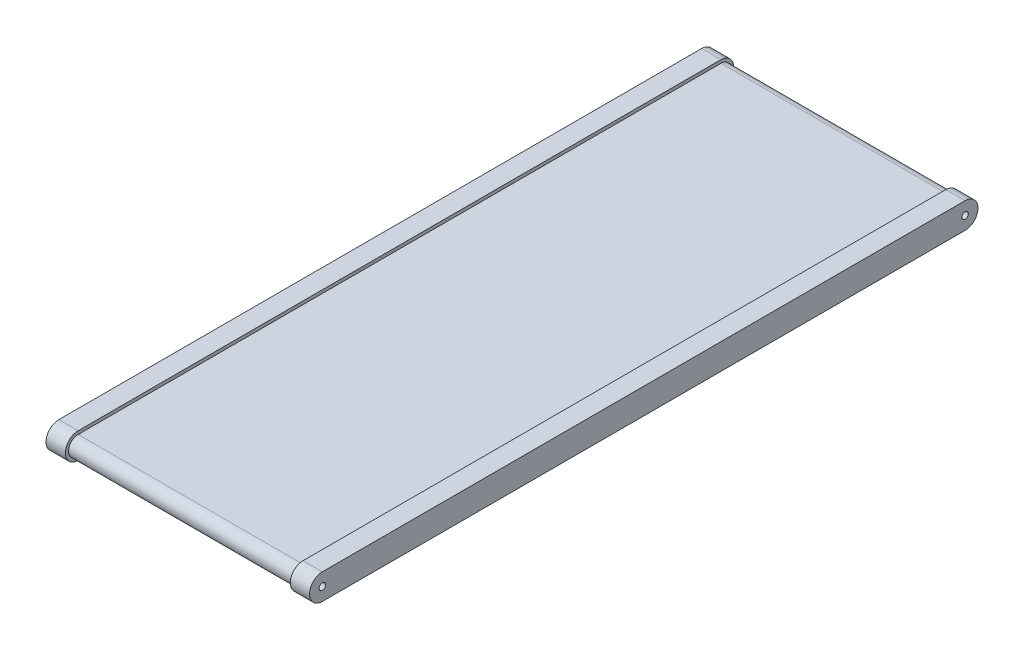
ISO-10303-21;
HEADER;
FILE_DESCRIPTION(('STEP AP214'),'2;1');
FILE_NAME('part.step','',(''),(''),'','','');
FILE_SCHEMA(('AUTOMOTIVE_DESIGN { 1 0 10303 214 1 1 1 1 }'));
ENDSEC;
DATA;
#1=APPLICATION_CONTEXT('core data for automotive mechanical design processes');
#2=APPLICATION_PROTOCOL_DEFINITION('international standard','automotive_design',2000,#1);
#3=PRODUCT_CONTEXT('',#1,'mechanical');
#4=PRODUCT('Part','Part','',(#3));
#5=PRODUCT_RELATED_PRODUCT_CATEGORY('part','',(#4));
#6=PRODUCT_DEFINITION_FORMATION('','',#4);
#7=PRODUCT_DEFINITION_CONTEXT('part definition',#1,'design');
#8=PRODUCT_DEFINITION('design','',#6,#7);
#9=PRODUCT_DEFINITION_SHAPE('','',#8);
#10=(LENGTH_UNIT() NAMED_UNIT(*) SI_UNIT(.MILLI.,.METRE.));
#11=(NAMED_UNIT(*) PLANE_ANGLE_UNIT() SI_UNIT($,.RADIAN.));
#12=(NAMED_UNIT(*) SI_UNIT($,.STERADIAN.) SOLID_ANGLE_UNIT());
#13=UNCERTAINTY_MEASURE_WITH_UNIT(LENGTH_MEASURE(1.E-05),#10,'distance_accuracy_value','');
#14=(GEOMETRIC_REPRESENTATION_CONTEXT(3) GLOBAL_UNCERTAINTY_ASSIGNED_CONTEXT((#13)) GLOBAL_UNIT_ASSIGNED_CONTEXT((#10,
#11,#12)) REPRESENTATION_CONTEXT('',''));
#15=CARTESIAN_POINT('',(0.,0.,0.));
#16=DIRECTION('',(0.,0.,1.));
#17=DIRECTION('',(1.,0.,0.));
#18=AXIS2_PLACEMENT_3D('',#15,#16,#17);
#19=CARTESIAN_POINT('',(350.,15.,0.));
#20=DIRECTION('',(-1.,0.,0.));
#21=DIRECTION('',(0.,0.,1.));
#22=AXIS2_PLACEMENT_3D('',#19,#20,#21);
#23=CYLINDRICAL_SURFACE('',#22,15.);
#24=CARTESIAN_POINT('',(0.,15.,0.));
#25=DIRECTION('',(1.,0.,0.));
#26=DIRECTION('',(0.,0.,-1.));
#27=AXIS2_PLACEMENT_3D('',#24,#25,#26);
#28=CIRCLE('',#27,15.);
#29=CARTESIAN_POINT('',(0.,30.,0.));
#30=VERTEX_POINT('',#29);
#31=CARTESIAN_POINT('',(0.,0.,0.));
#32=VERTEX_POINT('',#31);
#33=EDGE_CURVE('E82',#30,#32,#28,.T.);
#34=ORIENTED_EDGE('',*,*,#33,.T.);
#35=DIRECTION('',(-1.,0.,0.));
#36=VECTOR('',#35,1.);
#37=CARTESIAN_POINT('',(350.,0.,0.));
#38=LINE('',#37,#36);
#39=CARTESIAN_POINT('',(350.,0.,0.));
#40=VERTEX_POINT('',#39);
#41=EDGE_CURVE('E11',#40,#32,#38,.T.);
#42=ORIENTED_EDGE('',*,*,#41,.F.);
#43=CARTESIAN_POINT('',(350.,15.,0.));
#44=DIRECTION('',(1.,0.,0.));
#45=DIRECTION('',(0.,0.,-1.));
#46=AXIS2_PLACEMENT_3D('',#43,#44,#45);
#47=CIRCLE('',#46,15.);
#48=CARTESIAN_POINT('',(350.,30.,0.));
#49=VERTEX_POINT('',#48);
#50=EDGE_CURVE('E89',#49,#40,#47,.T.);
#51=ORIENTED_EDGE('',*,*,#50,.F.);
#52=DIRECTION('',(-1.,0.,0.));
#53=VECTOR('',#52,1.);
#54=CARTESIAN_POINT('',(350.,30.,0.));
#55=LINE('',#54,#53);
#56=EDGE_CURVE('E93',#49,#30,#55,.T.);
#57=ORIENTED_EDGE('',*,*,#56,.T.);
#58=EDGE_LOOP('',(#34,#42,#51,#57));
#59=FACE_BOUND('',#58,.T.);
#60=ADVANCED_FACE('F37',(#59),#23,.T.);
#61=CARTESIAN_POINT('',(350.,0.,0.));
#62=DIRECTION('',(0.,1.,0.));
#63=DIRECTION('',(0.,0.,1.));
#64=AXIS2_PLACEMENT_3D('',#61,#62,#63);
#65=PLANE('',#64);
#66=DIRECTION('',(0.,0.,-1.));
#67=VECTOR('',#66,1.);
#68=CARTESIAN_POINT('',(0.,0.,0.));
#69=LINE('',#68,#67);
#70=CARTESIAN_POINT('',(0.,0.,-1000.));
#71=VERTEX_POINT('',#70);
#72=EDGE_CURVE('E76',#32,#71,#69,.T.);
#73=ORIENTED_EDGE('',*,*,#72,.T.);
#74=DIRECTION('',(-1.,0.,0.));
#75=VECTOR('',#74,1.);
#76=CARTESIAN_POINT('',(350.,0.,-1000.));
#77=LINE('',#76,#75);
#78=CARTESIAN_POINT('',(350.,0.,-1000.));
#79=VERTEX_POINT('',#78);
#80=EDGE_CURVE('E45',#79,#71,#77,.T.);
#81=ORIENTED_EDGE('',*,*,#80,.F.);
#82=DIRECTION('',(0.,0.,-1.));
#83=VECTOR('',#82,1.);
#84=CARTESIAN_POINT('',(350.,0.,0.));
#85=LINE('',#84,#83);
#86=EDGE_CURVE('E135',#40,#79,#85,.T.);
#87=ORIENTED_EDGE('',*,*,#86,.F.);
#88=ORIENTED_EDGE('',*,*,#41,.T.);
#89=EDGE_LOOP('',(#73,#81,#87,#88));
#90=FACE_BOUND('',#89,.T.);
#91=ADVANCED_FACE('F77',(#90),#65,.F.);
#92=CARTESIAN_POINT('',(350.,15.,-1000.));
#93=DIRECTION('',(-1.,0.,0.));
#94=DIRECTION('',(0.,0.,1.));
#95=AXIS2_PLACEMENT_3D('',#92,#93,#94);
#96=CYLINDRICAL_SURFACE('',#95,15.);
#97=CARTESIAN_POINT('',(0.,15.,-1000.));
#98=DIRECTION('',(1.,0.,0.));
#99=DIRECTION('',(0.,0.,-1.));
#100=AXIS2_PLACEMENT_3D('',#97,#98,#99);
#101=CIRCLE('',#100,15.);
#102=CARTESIAN_POINT('',(0.,30.,-1000.));
#103=VERTEX_POINT('',#102);
#104=EDGE_CURVE('E69',#103,#71,#101,.F.);
#105=ORIENTED_EDGE('',*,*,#104,.F.);
#106=DIRECTION('',(-1.,0.,0.));
#107=VECTOR('',#106,1.);
#108=CARTESIAN_POINT('',(350.,30.,-1000.));
#109=LINE('',#108,#107);
#110=CARTESIAN_POINT('',(350.,30.,-1000.));
#111=VERTEX_POINT('',#110);
#112=EDGE_CURVE('E74',#111,#103,#109,.T.);
#113=ORIENTED_EDGE('',*,*,#112,.F.);
#114=CARTESIAN_POINT('',(350.,15.,-1000.));
#115=DIRECTION('',(1.,0.,0.));
#116=DIRECTION('',(0.,0.,-1.));
#117=AXIS2_PLACEMENT_3D('',#114,#115,#116);
#118=CIRCLE('',#117,15.);
#119=EDGE_CURVE('E52',#111,#79,#118,.F.);
#120=ORIENTED_EDGE('',*,*,#119,.T.);
#121=ORIENTED_EDGE('',*,*,#80,.T.);
#122=EDGE_LOOP('',(#105,#113,#120,#121));
#123=FACE_BOUND('',#122,.T.);
#124=ADVANCED_FACE('F66',(#123),#96,.T.);
#125=CARTESIAN_POINT('',(350.,30.,0.));
#126=DIRECTION('',(0.,1.,0.));
#127=DIRECTION('',(0.,0.,1.));
#128=AXIS2_PLACEMENT_3D('',#125,#126,#127);
#129=PLANE('',#128);
#130=DIRECTION('',(0.,0.,-1.));
#131=VECTOR('',#130,1.);
#132=CARTESIAN_POINT('',(0.,30.,0.));
#133=LINE('',#132,#131);
#134=EDGE_CURVE('E87',#30,#103,#133,.T.);
#135=ORIENTED_EDGE('',*,*,#134,.F.);
#136=ORIENTED_EDGE('',*,*,#56,.F.);
#137=DIRECTION('',(0.,0.,-1.));
#138=VECTOR('',#137,1.);
#139=CARTESIAN_POINT('',(350.,30.,0.));
#140=LINE('',#139,#138);
#141=EDGE_CURVE('E95',#49,#111,#140,.T.);
#142=ORIENTED_EDGE('',*,*,#141,.T.);
#143=ORIENTED_EDGE('',*,*,#112,.T.);
#144=EDGE_LOOP('',(#135,#136,#142,#143));
#145=FACE_BOUND('',#144,.T.);
#146=ADVANCED_FACE('F98',(#145),#129,.T.);
#147=CARTESIAN_POINT('',(350.,0.,0.));
#148=DIRECTION('',(1.,0.,0.));
#149=DIRECTION('',(0.,0.,-1.));
#150=AXIS2_PLACEMENT_3D('',#147,#148,#149);
#151=PLANE('',#150);
#152=CARTESIAN_POINT('',(350.,15.0000000000002,-1000.));
#153=DIRECTION('',(1.,0.,0.));
#154=DIRECTION('',(0.,0.,-1.));
#155=AXIS2_PLACEMENT_3D('',#152,#153,#154);
#156=CIRCLE('',#155,19.9999999999998);
#157=CARTESIAN_POINT('',(350.,35.,-1000.));
#158=VERTEX_POINT('',#157);
#159=CARTESIAN_POINT('',(350.,-4.99999999999964,-1000.));
#160=VERTEX_POINT('',#159);
#161=EDGE_CURVE('E163',#158,#160,#156,.F.);
#162=ORIENTED_EDGE('',*,*,#161,.T.);
#163=DIRECTION('',(0.,0.,-1.));
#164=VECTOR('',#163,1.);
#165=CARTESIAN_POINT('',(350.,-5.,0.));
#166=LINE('',#165,#164);
#167=CARTESIAN_POINT('',(350.,-5.,0.));
#168=VERTEX_POINT('',#167);
#169=EDGE_CURVE('E154',#168,#160,#166,.T.);
#170=ORIENTED_EDGE('',*,*,#169,.F.);
#171=CARTESIAN_POINT('',(350.,15.,0.));
#172=DIRECTION('',(1.,0.,0.));
#173=DIRECTION('',(0.,0.,-1.));
#174=AXIS2_PLACEMENT_3D('',#171,#172,#173);
#175=CIRCLE('',#174,20.);
#176=CARTESIAN_POINT('',(350.,35.,0.));
#177=VERTEX_POINT('',#176);
#178=EDGE_CURVE('E158',#177,#168,#175,.T.);
#179=ORIENTED_EDGE('',*,*,#178,.F.);
#180=DIRECTION('',(0.,0.,-1.));
#181=VECTOR('',#180,1.);
#182=CARTESIAN_POINT('',(350.,35.,0.));
#183=LINE('',#182,#181);
#184=EDGE_CURVE('E160',#177,#158,#183,.T.);
#185=ORIENTED_EDGE('',*,*,#184,.T.);
#186=EDGE_LOOP('',(#162,#170,#179,#185));
#187=FACE_BOUND('',#186,.T.);
#188=ORIENTED_EDGE('',*,*,#141,.F.);
#189=ORIENTED_EDGE('',*,*,#50,.T.);
#190=ORIENTED_EDGE('',*,*,#86,.T.);
#191=ORIENTED_EDGE('',*,*,#119,.F.);
#192=EDGE_LOOP('',(#188,#189,#190,#191));
#193=FACE_BOUND('',#192,.T.);
#194=ADVANCED_FACE('F137',(#187,#193),#151,.F.);
#195=CARTESIAN_POINT('',(380.,15.0000000000002,-1000.));
#196=DIRECTION('',(-1.,0.,0.));
#197=DIRECTION('',(0.,0.,1.));
#198=AXIS2_PLACEMENT_3D('',#195,#196,#197);
#199=CYLINDRICAL_SURFACE('',#198,19.9999999999998);
#200=ORIENTED_EDGE('',*,*,#161,.F.);
#201=DIRECTION('',(-1.,0.,0.));
#202=VECTOR('',#201,1.);
#203=CARTESIAN_POINT('',(380.,35.,-1000.));
#204=LINE('',#203,#202);
#205=CARTESIAN_POINT('',(380.,35.,-1000.));
#206=VERTEX_POINT('',#205);
#207=EDGE_CURVE('E141',#206,#158,#204,.T.);
#208=ORIENTED_EDGE('',*,*,#207,.F.);
#209=CARTESIAN_POINT('',(380.,15.0000000000002,-1000.));
#210=DIRECTION('',(1.,0.,0.));
#211=DIRECTION('',(0.,0.,-1.));
#212=AXIS2_PLACEMENT_3D('',#209,#210,#211);
#213=CIRCLE('',#212,19.9999999999998);
#214=CARTESIAN_POINT('',(380.,-4.99999999999964,-1000.));
#215=VERTEX_POINT('',#214);
#216=EDGE_CURVE('E157',#206,#215,#213,.F.);
#217=ORIENTED_EDGE('',*,*,#216,.T.);
#218=DIRECTION('',(-1.,0.,0.));
#219=VECTOR('',#218,1.);
#220=CARTESIAN_POINT('',(380.,-4.99999999999964,-1000.));
#221=LINE('',#220,#219);
#222=EDGE_CURVE('E151',#215,#160,#221,.T.);
#223=ORIENTED_EDGE('',*,*,#222,.T.);
#224=EDGE_LOOP('',(#200,#208,#217,#223));
#225=FACE_BOUND('',#224,.T.);
#226=ADVANCED_FACE('F255',(#225),#199,.T.);
#227=CARTESIAN_POINT('',(380.,35.,0.));
#228=DIRECTION('',(0.,1.,0.));
#229=DIRECTION('',(0.,0.,1.));
#230=AXIS2_PLACEMENT_3D('',#227,#228,#229);
#231=PLANE('',#230);
#232=ORIENTED_EDGE('',*,*,#184,.F.);
#233=DIRECTION('',(-1.,0.,0.));
#234=VECTOR('',#233,1.);
#235=CARTESIAN_POINT('',(380.,35.,0.));
#236=LINE('',#235,#234);
#237=CARTESIAN_POINT('',(380.,35.,0.));
#238=VERTEX_POINT('',#237);
#239=EDGE_CURVE('E142',#238,#177,#236,.T.);
#240=ORIENTED_EDGE('',*,*,#239,.F.);
#241=DIRECTION('',(0.,0.,-1.));
#242=VECTOR('',#241,1.);
#243=CARTESIAN_POINT('',(380.,35.,0.));
#244=LINE('',#243,#242);
#245=EDGE_CURVE('E170',#238,#206,#244,.T.);
#246=ORIENTED_EDGE('',*,*,#245,.T.);
#247=ORIENTED_EDGE('',*,*,#207,.T.);
#248=EDGE_LOOP('',(#232,#240,#246,#247));
#249=FACE_BOUND('',#248,.T.);
#250=ADVANCED_FACE('F246',(#249),#231,.T.);
#251=CARTESIAN_POINT('',(380.,15.,0.));
#252=DIRECTION('',(-1.,0.,0.));
#253=DIRECTION('',(0.,0.,1.));
#254=AXIS2_PLACEMENT_3D('',#251,#252,#253);
#255=CYLINDRICAL_SURFACE('',#254,20.);
#256=ORIENTED_EDGE('',*,*,#178,.T.);
#257=DIRECTION('',(-1.,0.,0.));
#258=VECTOR('',#257,1.);
#259=CARTESIAN_POINT('',(380.,-5.,0.));
#260=LINE('',#259,#258);
#261=CARTESIAN_POINT('',(380.,-5.,0.));
#262=VERTEX_POINT('',#261);
#263=EDGE_CURVE('E148',#262,#168,#260,.T.);
#264=ORIENTED_EDGE('',*,*,#263,.F.);
#265=CARTESIAN_POINT('',(380.,15.,0.));
#266=DIRECTION('',(1.,0.,0.));
#267=DIRECTION('',(0.,0.,-1.));
#268=AXIS2_PLACEMENT_3D('',#265,#266,#267);
#269=CIRCLE('',#268,20.);
#270=EDGE_CURVE('E168',#238,#262,#269,.T.);
#271=ORIENTED_EDGE('',*,*,#270,.F.);
#272=ORIENTED_EDGE('',*,*,#239,.T.);
#273=EDGE_LOOP('',(#256,#264,#271,#272));
#274=FACE_BOUND('',#273,.T.);
#275=ADVANCED_FACE('F252',(#274),#255,.T.);
#276=CARTESIAN_POINT('',(380.,-5.,0.));
#277=DIRECTION('',(0.,1.,0.));
#278=DIRECTION('',(0.,0.,1.));
#279=AXIS2_PLACEMENT_3D('',#276,#277,#278);
#280=PLANE('',#279);
#281=ORIENTED_EDGE('',*,*,#169,.T.);
#282=ORIENTED_EDGE('',*,*,#222,.F.);
#283=DIRECTION('',(0.,0.,-1.));
#284=VECTOR('',#283,1.);
#285=CARTESIAN_POINT('',(380.,-5.,0.));
#286=LINE('',#285,#284);
#287=EDGE_CURVE('E153',#262,#215,#286,.T.);
#288=ORIENTED_EDGE('',*,*,#287,.F.);
#289=ORIENTED_EDGE('',*,*,#263,.T.);
#290=EDGE_LOOP('',(#281,#282,#288,#289));
#291=FACE_BOUND('',#290,.T.);
#292=ADVANCED_FACE('F235',(#291),#280,.F.);
#293=CARTESIAN_POINT('',(380.,0.,0.));
#294=DIRECTION('',(1.,0.,0.));
#295=DIRECTION('',(0.,0.,-1.));
#296=AXIS2_PLACEMENT_3D('',#293,#294,#295);
#297=PLANE('',#296);
#298=CARTESIAN_POINT('',(380.,15.0000000000002,-1000.));
#299=DIRECTION('',(1.,0.,0.));
#300=DIRECTION('',(0.,0.,-1.));
#301=AXIS2_PLACEMENT_3D('',#298,#299,#300);
#302=CIRCLE('',#301,4.99999999999982);
#303=CARTESIAN_POINT('',(380.,15.0000000000002,-1005.));
#304=VERTEX_POINT('',#303);
#305=EDGE_CURVE('E216',#304,#304,#302,.T.);
#306=ORIENTED_EDGE('',*,*,#305,.F.);
#307=EDGE_LOOP('',(#306));
#308=FACE_BOUND('',#307,.T.);
#309=CARTESIAN_POINT('',(380.,15.,0.));
#310=DIRECTION('',(1.,0.,0.));
#311=DIRECTION('',(0.,0.,-1.));
#312=AXIS2_PLACEMENT_3D('',#309,#310,#311);
#313=CIRCLE('',#312,5.);
#314=CARTESIAN_POINT('',(380.,15.,-5.));
#315=VERTEX_POINT('',#314);
#316=EDGE_CURVE('E210',#315,#315,#313,.T.);
#317=ORIENTED_EDGE('',*,*,#316,.F.);
#318=EDGE_LOOP('',(#317));
#319=FACE_BOUND('',#318,.T.);
#320=ORIENTED_EDGE('',*,*,#216,.F.);
#321=ORIENTED_EDGE('',*,*,#245,.F.);
#322=ORIENTED_EDGE('',*,*,#270,.T.);
#323=ORIENTED_EDGE('',*,*,#287,.T.);
#324=EDGE_LOOP('',(#320,#321,#322,#323));
#325=FACE_BOUND('',#324,.T.);
#326=ADVANCED_FACE('F232',(#308,#319,#325),#297,.T.);
#327=CARTESIAN_POINT('',(0.,0.,0.));
#328=DIRECTION('',(1.,0.,0.));
#329=DIRECTION('',(0.,0.,-1.));
#330=AXIS2_PLACEMENT_3D('',#327,#328,#329);
#331=PLANE('',#330);
#332=CARTESIAN_POINT('',(0.,15.0000000000002,-1000.));
#333=DIRECTION('',(1.,0.,0.));
#334=DIRECTION('',(0.,0.,-1.));
#335=AXIS2_PLACEMENT_3D('',#332,#333,#334);
#336=CIRCLE('',#335,19.9999999999998);
#337=CARTESIAN_POINT('',(0.,35.,-1000.));
#338=VERTEX_POINT('',#337);
#339=CARTESIAN_POINT('',(0.,-4.99999999999964,-1000.));
#340=VERTEX_POINT('',#339);
#341=EDGE_CURVE('E190',#338,#340,#336,.F.);
#342=ORIENTED_EDGE('',*,*,#341,.F.);
#343=DIRECTION('',(0.,0.,-1.));
#344=VECTOR('',#343,1.);
#345=CARTESIAN_POINT('',(0.,35.,0.));
#346=LINE('',#345,#344);
#347=CARTESIAN_POINT('',(0.,35.,0.));
#348=VERTEX_POINT('',#347);
#349=EDGE_CURVE('E205',#348,#338,#346,.T.);
#350=ORIENTED_EDGE('',*,*,#349,.F.);
#351=CARTESIAN_POINT('',(0.,15.,0.));
#352=DIRECTION('',(1.,0.,0.));
#353=DIRECTION('',(0.,0.,-1.));
#354=AXIS2_PLACEMENT_3D('',#351,#352,#353);
#355=CIRCLE('',#354,20.);
#356=CARTESIAN_POINT('',(0.,-5.,0.));
#357=VERTEX_POINT('',#356);
#358=EDGE_CURVE('E202',#348,#357,#355,.T.);
#359=ORIENTED_EDGE('',*,*,#358,.T.);
#360=DIRECTION('',(0.,0.,-1.));
#361=VECTOR('',#360,1.);
#362=CARTESIAN_POINT('',(0.,-5.,0.));
#363=LINE('',#362,#361);
#364=EDGE_CURVE('E186',#357,#340,#363,.T.);
#365=ORIENTED_EDGE('',*,*,#364,.T.);
#366=EDGE_LOOP('',(#342,#350,#359,#365));
#367=FACE_BOUND('',#366,.T.);
#368=ORIENTED_EDGE('',*,*,#33,.F.);
#369=ORIENTED_EDGE('',*,*,#134,.T.);
#370=ORIENTED_EDGE('',*,*,#104,.T.);
#371=ORIENTED_EDGE('',*,*,#72,.F.);
#372=EDGE_LOOP('',(#368,#369,#370,#371));
#373=FACE_BOUND('',#372,.T.);
#374=ADVANCED_FACE('F85',(#367,#373),#331,.T.);
#375=CARTESIAN_POINT('',(0.,15.0000000000002,-1000.));
#376=DIRECTION('',(-1.,0.,0.));
#377=DIRECTION('',(0.,0.,1.));
#378=AXIS2_PLACEMENT_3D('',#375,#376,#377);
#379=CYLINDRICAL_SURFACE('',#378,19.9999999999998);
#380=CARTESIAN_POINT('',(-30.,15.0000000000002,-1000.));
#381=DIRECTION('',(1.,0.,0.));
#382=DIRECTION('',(0.,0.,-1.));
#383=AXIS2_PLACEMENT_3D('',#380,#381,#382);
#384=CIRCLE('',#383,19.9999999999998);
#385=CARTESIAN_POINT('',(-30.,35.,-1000.));
#386=VERTEX_POINT('',#385);
#387=CARTESIAN_POINT('',(-30.,-4.99999999999964,-1000.));
#388=VERTEX_POINT('',#387);
#389=EDGE_CURVE('E197',#386,#388,#384,.F.);
#390=ORIENTED_EDGE('',*,*,#389,.F.);
#391=DIRECTION('',(-1.,0.,0.));
#392=VECTOR('',#391,1.);
#393=CARTESIAN_POINT('',(0.,35.,-1000.));
#394=LINE('',#393,#392);
#395=EDGE_CURVE('E166',#338,#386,#394,.T.);
#396=ORIENTED_EDGE('',*,*,#395,.F.);
#397=ORIENTED_EDGE('',*,*,#341,.T.);
#398=DIRECTION('',(-1.,0.,0.));
#399=VECTOR('',#398,1.);
#400=CARTESIAN_POINT('',(0.,-4.99999999999964,-1000.));
#401=LINE('',#400,#399);
#402=EDGE_CURVE('E183',#340,#388,#401,.T.);
#403=ORIENTED_EDGE('',*,*,#402,.T.);
#404=EDGE_LOOP('',(#390,#396,#397,#403));
#405=FACE_BOUND('',#404,.T.);
#406=ADVANCED_FACE('F295',(#405),#379,.T.);
#407=CARTESIAN_POINT('',(0.,35.,0.));
#408=DIRECTION('',(0.,1.,0.));
#409=DIRECTION('',(0.,0.,1.));
#410=AXIS2_PLACEMENT_3D('',#407,#408,#409);
#411=PLANE('',#410);
#412=DIRECTION('',(0.,0.,-1.));
#413=VECTOR('',#412,1.);
#414=CARTESIAN_POINT('',(-30.,35.,0.));
#415=LINE('',#414,#413);
#416=CARTESIAN_POINT('',(-30.,35.,0.));
#417=VERTEX_POINT('',#416);
#418=EDGE_CURVE('E194',#417,#386,#415,.T.);
#419=ORIENTED_EDGE('',*,*,#418,.F.);
#420=DIRECTION('',(-1.,0.,0.));
#421=VECTOR('',#420,1.);
#422=CARTESIAN_POINT('',(0.,35.,0.));
#423=LINE('',#422,#421);
#424=EDGE_CURVE('E177',#348,#417,#423,.T.);
#425=ORIENTED_EDGE('',*,*,#424,.F.);
#426=ORIENTED_EDGE('',*,*,#349,.T.);
#427=ORIENTED_EDGE('',*,*,#395,.T.);
#428=EDGE_LOOP('',(#419,#425,#426,#427));
#429=FACE_BOUND('',#428,.T.);
#430=ADVANCED_FACE('F304',(#429),#411,.T.);
#431=CARTESIAN_POINT('',(0.,15.,0.));
#432=DIRECTION('',(-1.,0.,0.));
#433=DIRECTION('',(0.,0.,1.));
#434=AXIS2_PLACEMENT_3D('',#431,#432,#433);
#435=CYLINDRICAL_SURFACE('',#434,20.);
#436=CARTESIAN_POINT('',(-30.,15.,0.));
#437=DIRECTION('',(1.,0.,0.));
#438=DIRECTION('',(0.,0.,-1.));
#439=AXIS2_PLACEMENT_3D('',#436,#437,#438);
#440=CIRCLE('',#439,20.);
#441=CARTESIAN_POINT('',(-30.,-5.,0.));
#442=VERTEX_POINT('',#441);
#443=EDGE_CURVE('E191',#417,#442,#440,.T.);
#444=ORIENTED_EDGE('',*,*,#443,.T.);
#445=DIRECTION('',(-1.,0.,0.));
#446=VECTOR('',#445,1.);
#447=CARTESIAN_POINT('',(0.,-5.,0.));
#448=LINE('',#447,#446);
#449=EDGE_CURVE('E180',#357,#442,#448,.T.);
#450=ORIENTED_EDGE('',*,*,#449,.F.);
#451=ORIENTED_EDGE('',*,*,#358,.F.);
#452=ORIENTED_EDGE('',*,*,#424,.T.);
#453=EDGE_LOOP('',(#444,#450,#451,#452));
#454=FACE_BOUND('',#453,.T.);
#455=ADVANCED_FACE('F312',(#454),#435,.T.);
#456=CARTESIAN_POINT('',(0.,-5.,0.));
#457=DIRECTION('',(0.,1.,0.));
#458=DIRECTION('',(0.,0.,1.));
#459=AXIS2_PLACEMENT_3D('',#456,#457,#458);
#460=PLANE('',#459);
#461=DIRECTION('',(0.,0.,-1.));
#462=VECTOR('',#461,1.);
#463=CARTESIAN_POINT('',(-30.,-5.,0.));
#464=LINE('',#463,#462);
#465=EDGE_CURVE('E187',#442,#388,#464,.T.);
#466=ORIENTED_EDGE('',*,*,#465,.T.);
#467=ORIENTED_EDGE('',*,*,#402,.F.);
#468=ORIENTED_EDGE('',*,*,#364,.F.);
#469=ORIENTED_EDGE('',*,*,#449,.T.);
#470=EDGE_LOOP('',(#466,#467,#468,#469));
#471=FACE_BOUND('',#470,.T.);
#472=ADVANCED_FACE('F320',(#471),#460,.F.);
#473=CARTESIAN_POINT('',(-30.,0.,0.));
#474=DIRECTION('',(1.,0.,0.));
#475=DIRECTION('',(0.,0.,-1.));
#476=AXIS2_PLACEMENT_3D('',#473,#474,#475);
#477=PLANE('',#476);
#478=CARTESIAN_POINT('',(-30.,15.0000000000002,-1000.));
#479=DIRECTION('',(1.,0.,0.));
#480=DIRECTION('',(0.,0.,-1.));
#481=AXIS2_PLACEMENT_3D('',#478,#479,#480);
#482=CIRCLE('',#481,4.99999999999982);
#483=CARTESIAN_POINT('',(-30.,15.0000000000002,-1005.));
#484=VERTEX_POINT('',#483);
#485=EDGE_CURVE('E213',#484,#484,#482,.T.);
#486=ORIENTED_EDGE('',*,*,#485,.T.);
#487=EDGE_LOOP('',(#486));
#488=FACE_BOUND('',#487,.T.);
#489=CARTESIAN_POINT('',(-30.,15.,0.));
#490=DIRECTION('',(1.,0.,0.));
#491=DIRECTION('',(0.,0.,-1.));
#492=AXIS2_PLACEMENT_3D('',#489,#490,#491);
#493=CIRCLE('',#492,5.);
#494=CARTESIAN_POINT('',(-30.,15.,-5.));
#495=VERTEX_POINT('',#494);
#496=EDGE_CURVE('E200',#495,#495,#493,.T.);
#497=ORIENTED_EDGE('',*,*,#496,.T.);
#498=EDGE_LOOP('',(#497));
#499=FACE_BOUND('',#498,.T.);
#500=ORIENTED_EDGE('',*,*,#389,.T.);
#501=ORIENTED_EDGE('',*,*,#465,.F.);
#502=ORIENTED_EDGE('',*,*,#443,.F.);
#503=ORIENTED_EDGE('',*,*,#418,.T.);
#504=EDGE_LOOP('',(#500,#501,#502,#503));
#505=FACE_BOUND('',#504,.T.);
#506=ADVANCED_FACE('F222',(#488,#499,#505),#477,.F.);
#507=CARTESIAN_POINT('',(-30.,15.,0.));
#508=DIRECTION('',(1.,0.,0.));
#509=DIRECTION('',(0.,0.,-1.));
#510=AXIS2_PLACEMENT_3D('',#507,#508,#509);
#511=CYLINDRICAL_SURFACE('',#510,5.);
#512=ORIENTED_EDGE('',*,*,#496,.F.);
#513=EDGE_LOOP('',(#512));
#514=FACE_BOUND('',#513,.T.);
#515=ORIENTED_EDGE('',*,*,#316,.T.);
#516=EDGE_LOOP('',(#515));
#517=FACE_BOUND('',#516,.T.);
#518=ADVANCED_FACE('F228',(#514,#517),#511,.F.);
#519=CARTESIAN_POINT('',(-30.,15.0000000000002,-1000.));
#520=DIRECTION('',(1.,0.,0.));
#521=DIRECTION('',(0.,0.,-1.));
#522=AXIS2_PLACEMENT_3D('',#519,#520,#521);
#523=CYLINDRICAL_SURFACE('',#522,4.99999999999982);
#524=ORIENTED_EDGE('',*,*,#485,.F.);
#525=EDGE_LOOP('',(#524));
#526=FACE_BOUND('',#525,.T.);
#527=ORIENTED_EDGE('',*,*,#305,.T.);
#528=EDGE_LOOP('',(#527));
#529=FACE_BOUND('',#528,.T.);
#530=ADVANCED_FACE('F225',(#526,#529),#523,.F.);
#531=CLOSED_SHELL('',(#60,#91,#124,#146,#194,#226,#250,#275,#292,#326,#374,#406,#430,#455,#472,
#506,#518,#530));
#532=MANIFOLD_SOLID_BREP('B2',#531);
#533=ADVANCED_BREP_SHAPE_REPRESENTATION('',(#18,#532),#14);
#534=SHAPE_DEFINITION_REPRESENTATION(#9,#533);
ENDSEC;
END-ISO-10303-21;
